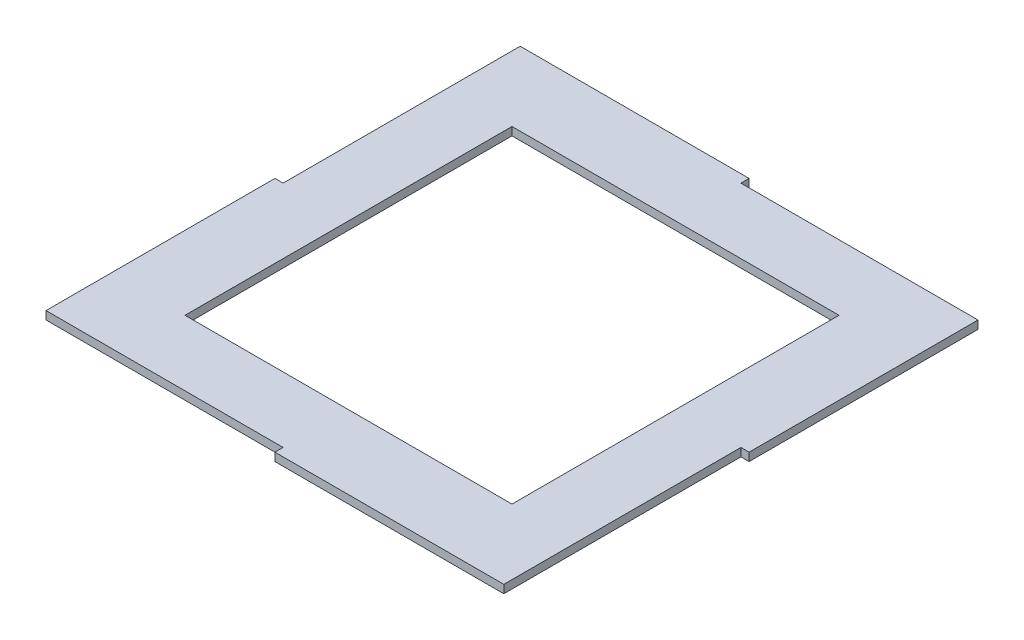
ISO-10303-21;
HEADER;
FILE_DESCRIPTION(('STEP AP214'),'2;1');
FILE_NAME('part.step','',(''),(''),'','','');
FILE_SCHEMA(('AUTOMOTIVE_DESIGN { 1 0 10303 214 1 1 1 1 }'));
ENDSEC;
DATA;
#1=APPLICATION_CONTEXT('core data for automotive mechanical design processes');
#2=APPLICATION_PROTOCOL_DEFINITION('international standard','automotive_design',2000,#1);
#3=PRODUCT_CONTEXT('',#1,'mechanical');
#4=PRODUCT('Part','Part','',(#3));
#5=PRODUCT_RELATED_PRODUCT_CATEGORY('part','',(#4));
#6=PRODUCT_DEFINITION_FORMATION('','',#4);
#7=PRODUCT_DEFINITION_CONTEXT('part definition',#1,'design');
#8=PRODUCT_DEFINITION('design','',#6,#7);
#9=PRODUCT_DEFINITION_SHAPE('','',#8);
#10=(LENGTH_UNIT() NAMED_UNIT(*) SI_UNIT(.MILLI.,.METRE.));
#11=(NAMED_UNIT(*) PLANE_ANGLE_UNIT() SI_UNIT($,.RADIAN.));
#12=(NAMED_UNIT(*) SI_UNIT($,.STERADIAN.) SOLID_ANGLE_UNIT());
#13=UNCERTAINTY_MEASURE_WITH_UNIT(LENGTH_MEASURE(1.E-05),#10,'distance_accuracy_value','');
#14=(GEOMETRIC_REPRESENTATION_CONTEXT(3) GLOBAL_UNCERTAINTY_ASSIGNED_CONTEXT((#13)) GLOBAL_UNIT_ASSIGNED_CONTEXT((#10,
#11,#12)) REPRESENTATION_CONTEXT('',''));
#15=CARTESIAN_POINT('',(0.,0.,0.));
#16=DIRECTION('',(0.,0.,1.));
#17=DIRECTION('',(1.,0.,0.));
#18=AXIS2_PLACEMENT_3D('',#15,#16,#17);
#19=CARTESIAN_POINT('',(0.,3.175,59.0872881355933));
#20=DIRECTION('',(0.,0.,1.));
#21=DIRECTION('',(1.,0.,0.));
#22=AXIS2_PLACEMENT_3D('',#19,#20,#21);
#23=PLANE('',#22);
#24=DIRECTION('',(-1.,0.,0.));
#25=VECTOR('',#24,1.);
#26=CARTESIAN_POINT('',(0.,0.,59.0872881355933));
#27=LINE('',#26,#25);
#28=CARTESIAN_POINT('',(39.8937853107345,0.,59.0872881355932));
#29=VERTEX_POINT('',#28);
#30=CARTESIAN_POINT('',(-87.1062146892655,0.,59.0872881355933));
#31=VERTEX_POINT('',#30);
#32=EDGE_CURVE('E215',#29,#31,#27,.T.);
#33=ORIENTED_EDGE('',*,*,#32,.T.);
#34=DIRECTION('',(0.,-1.,0.));
#35=VECTOR('',#34,1.);
#36=CARTESIAN_POINT('',(-87.1062146892655,3.175,59.0872881355933));
#37=LINE('',#36,#35);
#38=CARTESIAN_POINT('',(-87.1062146892655,3.175,59.0872881355933));
#39=VERTEX_POINT('',#38);
#40=EDGE_CURVE('E11',#39,#31,#37,.T.);
#41=ORIENTED_EDGE('',*,*,#40,.F.);
#42=DIRECTION('',(-1.,0.,0.));
#43=VECTOR('',#42,1.);
#44=CARTESIAN_POINT('',(0.,3.175,59.0872881355933));
#45=LINE('',#44,#43);
#46=CARTESIAN_POINT('',(39.8937853107345,3.175,59.0872881355932));
#47=VERTEX_POINT('',#46);
#48=EDGE_CURVE('E162',#47,#39,#45,.T.);
#49=ORIENTED_EDGE('',*,*,#48,.F.);
#50=DIRECTION('',(0.,-1.,0.));
#51=VECTOR('',#50,1.);
#52=CARTESIAN_POINT('',(39.8937853107345,3.175,59.0872881355932));
#53=LINE('',#52,#51);
#54=EDGE_CURVE('E54',#47,#29,#53,.T.);
#55=ORIENTED_EDGE('',*,*,#54,.T.);
#56=EDGE_LOOP('',(#33,#41,#49,#55));
#57=FACE_BOUND('',#56,.T.);
#58=ADVANCED_FACE('F35',(#57),#23,.F.);
#59=CARTESIAN_POINT('',(-87.1062146892655,3.175,0.));
#60=DIRECTION('',(-1.,0.,0.));
#61=DIRECTION('',(0.,0.,1.));
#62=AXIS2_PLACEMENT_3D('',#59,#60,#61);
#63=PLANE('',#62);
#64=DIRECTION('',(0.,0.,-1.));
#65=VECTOR('',#64,1.);
#66=CARTESIAN_POINT('',(-87.1062146892655,0.,0.));
#67=LINE('',#66,#65);
#68=CARTESIAN_POINT('',(-87.1062146892655,0.,-67.9127118644067));
#69=VERTEX_POINT('',#68);
#70=EDGE_CURVE('E168',#31,#69,#67,.T.);
#71=ORIENTED_EDGE('',*,*,#70,.T.);
#72=DIRECTION('',(0.,-1.,0.));
#73=VECTOR('',#72,1.);
#74=CARTESIAN_POINT('',(-87.1062146892655,3.175,-67.9127118644067));
#75=LINE('',#74,#73);
#76=CARTESIAN_POINT('',(-87.1062146892655,3.175,-67.9127118644067));
#77=VERTEX_POINT('',#76);
#78=EDGE_CURVE('E45',#77,#69,#75,.T.);
#79=ORIENTED_EDGE('',*,*,#78,.F.);
#80=DIRECTION('',(0.,0.,-1.));
#81=VECTOR('',#80,1.);
#82=CARTESIAN_POINT('',(-87.1062146892655,3.175,0.));
#83=LINE('',#82,#81);
#84=EDGE_CURVE('E156',#39,#77,#83,.T.);
#85=ORIENTED_EDGE('',*,*,#84,.F.);
#86=ORIENTED_EDGE('',*,*,#40,.T.);
#87=EDGE_LOOP('',(#71,#79,#85,#86));
#88=FACE_BOUND('',#87,.T.);
#89=ADVANCED_FACE('F167',(#88),#63,.F.);
#90=CARTESIAN_POINT('',(0.,3.175,-67.9127118644067));
#91=DIRECTION('',(0.,0.,1.));
#92=DIRECTION('',(1.,0.,0.));
#93=AXIS2_PLACEMENT_3D('',#90,#91,#92);
#94=PLANE('',#93);
#95=DIRECTION('',(-1.,0.,0.));
#96=VECTOR('',#95,1.);
#97=CARTESIAN_POINT('',(0.,0.,-67.9127118644067));
#98=LINE('',#97,#96);
#99=CARTESIAN_POINT('',(39.8937853107345,0.,-67.9127118644068));
#100=VERTEX_POINT('',#99);
#101=EDGE_CURVE('E218',#100,#69,#98,.T.);
#102=ORIENTED_EDGE('',*,*,#101,.F.);
#103=DIRECTION('',(0.,-1.,0.));
#104=VECTOR('',#103,1.);
#105=CARTESIAN_POINT('',(39.8937853107345,3.175,-67.9127118644068));
#106=LINE('',#105,#104);
#107=CARTESIAN_POINT('',(39.8937853107345,3.175,-67.9127118644068));
#108=VERTEX_POINT('',#107);
#109=EDGE_CURVE('E104',#108,#100,#106,.T.);
#110=ORIENTED_EDGE('',*,*,#109,.F.);
#111=DIRECTION('',(-1.,0.,0.));
#112=VECTOR('',#111,1.);
#113=CARTESIAN_POINT('',(0.,3.175,-67.9127118644067));
#114=LINE('',#113,#112);
#115=EDGE_CURVE('E161',#108,#77,#114,.T.);
#116=ORIENTED_EDGE('',*,*,#115,.T.);
#117=ORIENTED_EDGE('',*,*,#78,.T.);
#118=EDGE_LOOP('',(#102,#110,#116,#117));
#119=FACE_BOUND('',#118,.T.);
#120=ADVANCED_FACE('F172',(#119),#94,.T.);
#121=CARTESIAN_POINT('',(0.,3.175,-4.4127118644068));
#122=DIRECTION('',(0.,0.,-1.));
#123=DIRECTION('',(-1.,0.,0.));
#124=AXIS2_PLACEMENT_3D('',#121,#122,#123);
#125=PLANE('',#124);
#126=DIRECTION('',(1.,0.,0.));
#127=VECTOR('',#126,1.);
#128=CARTESIAN_POINT('',(0.,0.,-4.4127118644068));
#129=LINE('',#128,#127);
#130=CARTESIAN_POINT('',(-115.681214689266,0.,-4.41271186440677));
#131=VERTEX_POINT('',#130);
#132=CARTESIAN_POINT('',(-112.506214689266,0.,-4.41271186440677));
#133=VERTEX_POINT('',#132);
#134=EDGE_CURVE('E179',#131,#133,#129,.T.);
#135=ORIENTED_EDGE('',*,*,#134,.F.);
#136=DIRECTION('',(0.,-1.,0.));
#137=VECTOR('',#136,1.);
#138=CARTESIAN_POINT('',(-115.681214689266,3.175,-4.41271186440677));
#139=LINE('',#138,#137);
#140=CARTESIAN_POINT('',(-115.681214689266,3.175,-4.41271186440677));
#141=VERTEX_POINT('',#140);
#142=EDGE_CURVE('E39',#141,#131,#139,.T.);
#143=ORIENTED_EDGE('',*,*,#142,.F.);
#144=DIRECTION('',(1.,0.,0.));
#145=VECTOR('',#144,1.);
#146=CARTESIAN_POINT('',(0.,3.175,-4.4127118644068));
#147=LINE('',#146,#145);
#148=CARTESIAN_POINT('',(-112.506214689266,3.175,-4.41271186440677));
#149=VERTEX_POINT('',#148);
#150=EDGE_CURVE('E223',#141,#149,#147,.T.);
#151=ORIENTED_EDGE('',*,*,#150,.T.);
#152=DIRECTION('',(0.,-1.,0.));
#153=VECTOR('',#152,1.);
#154=CARTESIAN_POINT('',(-112.506214689266,3.175,-4.41271186440677));
#155=LINE('',#154,#153);
#156=EDGE_CURVE('E175',#149,#133,#155,.T.);
#157=ORIENTED_EDGE('',*,*,#156,.T.);
#158=EDGE_LOOP('',(#135,#143,#151,#157));
#159=FACE_BOUND('',#158,.T.);
#160=ADVANCED_FACE('F37',(#159),#125,.T.);
#161=CARTESIAN_POINT('',(-115.681214689266,3.175,0.));
#162=DIRECTION('',(-1.,0.,0.));
#163=DIRECTION('',(0.,0.,1.));
#164=AXIS2_PLACEMENT_3D('',#161,#162,#163);
#165=PLANE('',#164);
#166=DIRECTION('',(0.,0.,-1.));
#167=VECTOR('',#166,1.);
#168=CARTESIAN_POINT('',(-115.681214689266,0.,0.));
#169=LINE('',#168,#167);
#170=CARTESIAN_POINT('',(-115.681214689266,0.,84.4872881355932));
#171=VERTEX_POINT('',#170);
#172=EDGE_CURVE('E182',#171,#131,#169,.T.);
#173=ORIENTED_EDGE('',*,*,#172,.F.);
#174=DIRECTION('',(0.,-1.,0.));
#175=VECTOR('',#174,1.);
#176=CARTESIAN_POINT('',(-115.681214689266,3.175,84.4872881355932));
#177=LINE('',#176,#175);
#178=CARTESIAN_POINT('',(-115.681214689266,3.175,84.4872881355932));
#179=VERTEX_POINT('',#178);
#180=EDGE_CURVE('E244',#179,#171,#177,.T.);
#181=ORIENTED_EDGE('',*,*,#180,.F.);
#182=DIRECTION('',(0.,0.,-1.));
#183=VECTOR('',#182,1.);
#184=CARTESIAN_POINT('',(-115.681214689266,3.175,0.));
#185=LINE('',#184,#183);
#186=EDGE_CURVE('E253',#179,#141,#185,.T.);
#187=ORIENTED_EDGE('',*,*,#186,.T.);
#188=ORIENTED_EDGE('',*,*,#142,.T.);
#189=EDGE_LOOP('',(#173,#181,#187,#188));
#190=FACE_BOUND('',#189,.T.);
#191=ADVANCED_FACE('F251',(#190),#165,.T.);
#192=CARTESIAN_POINT('',(0.,3.175,84.4872881355932));
#193=DIRECTION('',(0.,0.,1.));
#194=DIRECTION('',(1.,0.,0.));
#195=AXIS2_PLACEMENT_3D('',#192,#193,#194);
#196=PLANE('',#195);
#197=DIRECTION('',(-1.,0.,0.));
#198=VECTOR('',#197,1.);
#199=CARTESIAN_POINT('',(0.,0.,84.4872881355932));
#200=LINE('',#199,#198);
#201=CARTESIAN_POINT('',(-23.6062146892655,0.,84.4872881355932));
#202=VERTEX_POINT('',#201);
#203=EDGE_CURVE('E185',#202,#171,#200,.T.);
#204=ORIENTED_EDGE('',*,*,#203,.F.);
#205=DIRECTION('',(0.,-1.,0.));
#206=VECTOR('',#205,1.);
#207=CARTESIAN_POINT('',(-23.6062146892655,3.175,84.4872881355932));
#208=LINE('',#207,#206);
#209=CARTESIAN_POINT('',(-23.6062146892655,3.175,84.4872881355932));
#210=VERTEX_POINT('',#209);
#211=EDGE_CURVE('E243',#210,#202,#208,.T.);
#212=ORIENTED_EDGE('',*,*,#211,.F.);
#213=DIRECTION('',(-1.,0.,0.));
#214=VECTOR('',#213,1.);
#215=CARTESIAN_POINT('',(0.,3.175,84.4872881355932));
#216=LINE('',#215,#214);
#217=EDGE_CURVE('E262',#210,#179,#216,.T.);
#218=ORIENTED_EDGE('',*,*,#217,.T.);
#219=ORIENTED_EDGE('',*,*,#180,.T.);
#220=EDGE_LOOP('',(#204,#212,#218,#219));
#221=FACE_BOUND('',#220,.T.);
#222=ADVANCED_FACE('F260',(#221),#196,.T.);
#223=CARTESIAN_POINT('',(-23.6062146892651,3.175,-1.03181744379003E-13));
#224=DIRECTION('',(-1.,0.,0.));
#225=DIRECTION('',(0.,0.,1.));
#226=AXIS2_PLACEMENT_3D('',#223,#224,#225);
#227=PLANE('',#226);
#228=DIRECTION('',(0.,0.,-1.));
#229=VECTOR('',#228,1.);
#230=CARTESIAN_POINT('',(-23.6062146892651,0.,-1.03181744379003E-13));
#231=LINE('',#230,#229);
#232=CARTESIAN_POINT('',(-23.6062146892655,0.,87.6622881355932));
#233=VERTEX_POINT('',#232);
#234=EDGE_CURVE('E188',#233,#202,#231,.T.);
#235=ORIENTED_EDGE('',*,*,#234,.F.);
#236=DIRECTION('',(0.,-1.,0.));
#237=VECTOR('',#236,1.);
#238=CARTESIAN_POINT('',(-23.6062146892655,3.175,87.6622881355932));
#239=LINE('',#238,#237);
#240=CARTESIAN_POINT('',(-23.6062146892655,3.175,87.6622881355932));
#241=VERTEX_POINT('',#240);
#242=EDGE_CURVE('E241',#241,#233,#239,.T.);
#243=ORIENTED_EDGE('',*,*,#242,.F.);
#244=DIRECTION('',(0.,0.,-1.));
#245=VECTOR('',#244,1.);
#246=CARTESIAN_POINT('',(-23.6062146892651,3.175,-1.03181744379003E-13));
#247=LINE('',#246,#245);
#248=EDGE_CURVE('E268',#241,#210,#247,.T.);
#249=ORIENTED_EDGE('',*,*,#248,.T.);
#250=ORIENTED_EDGE('',*,*,#211,.T.);
#251=EDGE_LOOP('',(#235,#243,#249,#250));
#252=FACE_BOUND('',#251,.T.);
#253=ADVANCED_FACE('F271',(#252),#227,.T.);
#254=CARTESIAN_POINT('',(0.,3.175,87.6622881355932));
#255=DIRECTION('',(0.,0.,1.));
#256=DIRECTION('',(1.,0.,0.));
#257=AXIS2_PLACEMENT_3D('',#254,#255,#256);
#258=PLANE('',#257);
#259=DIRECTION('',(-1.,0.,0.));
#260=VECTOR('',#259,1.);
#261=CARTESIAN_POINT('',(0.,0.,87.6622881355932));
#262=LINE('',#261,#260);
#263=CARTESIAN_POINT('',(65.2937853107345,0.,87.6622881355932));
#264=VERTEX_POINT('',#263);
#265=EDGE_CURVE('E191',#264,#233,#262,.T.);
#266=ORIENTED_EDGE('',*,*,#265,.F.);
#267=DIRECTION('',(0.,-1.,0.));
#268=VECTOR('',#267,1.);
#269=CARTESIAN_POINT('',(65.2937853107345,3.175,87.6622881355932));
#270=LINE('',#269,#268);
#271=CARTESIAN_POINT('',(65.2937853107345,3.175,87.6622881355932));
#272=VERTEX_POINT('',#271);
#273=EDGE_CURVE('E239',#272,#264,#270,.T.);
#274=ORIENTED_EDGE('',*,*,#273,.F.);
#275=DIRECTION('',(-1.,0.,0.));
#276=VECTOR('',#275,1.);
#277=CARTESIAN_POINT('',(0.,3.175,87.6622881355932));
#278=LINE('',#277,#276);
#279=EDGE_CURVE('E272',#272,#241,#278,.T.);
#280=ORIENTED_EDGE('',*,*,#279,.T.);
#281=ORIENTED_EDGE('',*,*,#242,.T.);
#282=EDGE_LOOP('',(#266,#274,#280,#281));
#283=FACE_BOUND('',#282,.T.);
#284=ADVANCED_FACE('F326',(#283),#258,.T.);
#285=CARTESIAN_POINT('',(65.2937853107345,3.175,0.));
#286=DIRECTION('',(1.,0.,0.));
#287=DIRECTION('',(0.,0.,-1.));
#288=AXIS2_PLACEMENT_3D('',#285,#286,#287);
#289=PLANE('',#288);
#290=DIRECTION('',(0.,0.,1.));
#291=VECTOR('',#290,1.);
#292=CARTESIAN_POINT('',(65.2937853107345,0.,0.));
#293=LINE('',#292,#291);
#294=CARTESIAN_POINT('',(65.2937853107345,0.,-4.41271186440677));
#295=VERTEX_POINT('',#294);
#296=EDGE_CURVE('E194',#295,#264,#293,.T.);
#297=ORIENTED_EDGE('',*,*,#296,.F.);
#298=DIRECTION('',(0.,-1.,0.));
#299=VECTOR('',#298,1.);
#300=CARTESIAN_POINT('',(65.2937853107345,3.175,-4.41271186440677));
#301=LINE('',#300,#299);
#302=CARTESIAN_POINT('',(65.2937853107345,3.175,-4.41271186440677));
#303=VERTEX_POINT('',#302);
#304=EDGE_CURVE('E237',#303,#295,#301,.T.);
#305=ORIENTED_EDGE('',*,*,#304,.F.);
#306=DIRECTION('',(0.,0.,1.));
#307=VECTOR('',#306,1.);
#308=CARTESIAN_POINT('',(65.2937853107345,3.175,0.));
#309=LINE('',#308,#307);
#310=EDGE_CURVE('E274',#303,#272,#309,.T.);
#311=ORIENTED_EDGE('',*,*,#310,.T.);
#312=ORIENTED_EDGE('',*,*,#273,.T.);
#313=EDGE_LOOP('',(#297,#305,#311,#312));
#314=FACE_BOUND('',#313,.T.);
#315=ADVANCED_FACE('F323',(#314),#289,.T.);
#316=CARTESIAN_POINT('',(0.,3.175,-4.41271186440675));
#317=DIRECTION('',(0.,0.,1.));
#318=DIRECTION('',(1.,0.,0.));
#319=AXIS2_PLACEMENT_3D('',#316,#317,#318);
#320=PLANE('',#319);
#321=DIRECTION('',(-1.,0.,0.));
#322=VECTOR('',#321,1.);
#323=CARTESIAN_POINT('',(0.,0.,-4.41271186440675));
#324=LINE('',#323,#322);
#325=CARTESIAN_POINT('',(68.4687853107345,0.,-4.41271186440677));
#326=VERTEX_POINT('',#325);
#327=EDGE_CURVE('E197',#326,#295,#324,.T.);
#328=ORIENTED_EDGE('',*,*,#327,.F.);
#329=DIRECTION('',(0.,-1.,0.));
#330=VECTOR('',#329,1.);
#331=CARTESIAN_POINT('',(68.4687853107345,3.175,-4.41271186440677));
#332=LINE('',#331,#330);
#333=CARTESIAN_POINT('',(68.4687853107345,3.175,-4.41271186440677));
#334=VERTEX_POINT('',#333);
#335=EDGE_CURVE('E235',#334,#326,#332,.T.);
#336=ORIENTED_EDGE('',*,*,#335,.F.);
#337=DIRECTION('',(-1.,0.,0.));
#338=VECTOR('',#337,1.);
#339=CARTESIAN_POINT('',(0.,3.175,-4.41271186440675));
#340=LINE('',#339,#338);
#341=EDGE_CURVE('E280',#334,#303,#340,.T.);
#342=ORIENTED_EDGE('',*,*,#341,.T.);
#343=ORIENTED_EDGE('',*,*,#304,.T.);
#344=EDGE_LOOP('',(#328,#336,#342,#343));
#345=FACE_BOUND('',#344,.T.);
#346=ADVANCED_FACE('F319',(#345),#320,.T.);
#347=CARTESIAN_POINT('',(68.4687853107345,3.175,0.));
#348=DIRECTION('',(1.,0.,0.));
#349=DIRECTION('',(0.,0.,-1.));
#350=AXIS2_PLACEMENT_3D('',#347,#348,#349);
#351=PLANE('',#350);
#352=DIRECTION('',(0.,0.,1.));
#353=VECTOR('',#352,1.);
#354=CARTESIAN_POINT('',(68.4687853107345,0.,0.));
#355=LINE('',#354,#353);
#356=CARTESIAN_POINT('',(68.4687853107345,0.,-93.3127118644068));
#357=VERTEX_POINT('',#356);
#358=EDGE_CURVE('E200',#357,#326,#355,.T.);
#359=ORIENTED_EDGE('',*,*,#358,.F.);
#360=DIRECTION('',(0.,-1.,0.));
#361=VECTOR('',#360,1.);
#362=CARTESIAN_POINT('',(68.4687853107345,3.175,-93.3127118644068));
#363=LINE('',#362,#361);
#364=CARTESIAN_POINT('',(68.4687853107345,3.175,-93.3127118644068));
#365=VERTEX_POINT('',#364);
#366=EDGE_CURVE('E233',#365,#357,#363,.T.);
#367=ORIENTED_EDGE('',*,*,#366,.F.);
#368=DIRECTION('',(0.,0.,1.));
#369=VECTOR('',#368,1.);
#370=CARTESIAN_POINT('',(68.4687853107345,3.175,0.));
#371=LINE('',#370,#369);
#372=EDGE_CURVE('E283',#365,#334,#371,.T.);
#373=ORIENTED_EDGE('',*,*,#372,.T.);
#374=ORIENTED_EDGE('',*,*,#335,.T.);
#375=EDGE_LOOP('',(#359,#367,#373,#374));
#376=FACE_BOUND('',#375,.T.);
#377=ADVANCED_FACE('F315',(#376),#351,.T.);
#378=CARTESIAN_POINT('',(0.,3.175,-93.3127118644068));
#379=DIRECTION('',(0.,0.,-1.));
#380=DIRECTION('',(-1.,0.,0.));
#381=AXIS2_PLACEMENT_3D('',#378,#379,#380);
#382=PLANE('',#381);
#383=DIRECTION('',(1.,0.,0.));
#384=VECTOR('',#383,1.);
#385=CARTESIAN_POINT('',(0.,0.,-93.3127118644068));
#386=LINE('',#385,#384);
#387=CARTESIAN_POINT('',(-23.6062146892655,0.,-93.3127118644068));
#388=VERTEX_POINT('',#387);
#389=EDGE_CURVE('E203',#388,#357,#386,.T.);
#390=ORIENTED_EDGE('',*,*,#389,.F.);
#391=DIRECTION('',(0.,-1.,0.));
#392=VECTOR('',#391,1.);
#393=CARTESIAN_POINT('',(-23.6062146892655,3.175,-93.3127118644068));
#394=LINE('',#393,#392);
#395=CARTESIAN_POINT('',(-23.6062146892655,3.175,-93.3127118644068));
#396=VERTEX_POINT('',#395);
#397=EDGE_CURVE('E231',#396,#388,#394,.T.);
#398=ORIENTED_EDGE('',*,*,#397,.F.);
#399=DIRECTION('',(1.,0.,0.));
#400=VECTOR('',#399,1.);
#401=CARTESIAN_POINT('',(0.,3.175,-93.3127118644068));
#402=LINE('',#401,#400);
#403=EDGE_CURVE('E286',#396,#365,#402,.T.);
#404=ORIENTED_EDGE('',*,*,#403,.T.);
#405=ORIENTED_EDGE('',*,*,#366,.T.);
#406=EDGE_LOOP('',(#390,#398,#404,#405));
#407=FACE_BOUND('',#406,.T.);
#408=ADVANCED_FACE('F311',(#407),#382,.T.);
#409=CARTESIAN_POINT('',(-23.6062146892654,3.175,0.));
#410=DIRECTION('',(1.,0.,0.));
#411=DIRECTION('',(0.,0.,-1.));
#412=AXIS2_PLACEMENT_3D('',#409,#410,#411);
#413=PLANE('',#412);
#414=DIRECTION('',(0.,0.,1.));
#415=VECTOR('',#414,1.);
#416=CARTESIAN_POINT('',(-23.6062146892654,0.,0.));
#417=LINE('',#416,#415);
#418=CARTESIAN_POINT('',(-23.6062146892655,0.,-96.4877118644068));
#419=VERTEX_POINT('',#418);
#420=EDGE_CURVE('E206',#419,#388,#417,.T.);
#421=ORIENTED_EDGE('',*,*,#420,.F.);
#422=DIRECTION('',(0.,-1.,0.));
#423=VECTOR('',#422,1.);
#424=CARTESIAN_POINT('',(-23.6062146892655,3.175,-96.4877118644068));
#425=LINE('',#424,#423);
#426=CARTESIAN_POINT('',(-23.6062146892655,3.175,-96.4877118644068));
#427=VERTEX_POINT('',#426);
#428=EDGE_CURVE('E229',#427,#419,#425,.T.);
#429=ORIENTED_EDGE('',*,*,#428,.F.);
#430=DIRECTION('',(0.,0.,1.));
#431=VECTOR('',#430,1.);
#432=CARTESIAN_POINT('',(-23.6062146892654,3.175,0.));
#433=LINE('',#432,#431);
#434=EDGE_CURVE('E289',#427,#396,#433,.T.);
#435=ORIENTED_EDGE('',*,*,#434,.T.);
#436=ORIENTED_EDGE('',*,*,#397,.T.);
#437=EDGE_LOOP('',(#421,#429,#435,#436));
#438=FACE_BOUND('',#437,.T.);
#439=ADVANCED_FACE('F307',(#438),#413,.T.);
#440=CARTESIAN_POINT('',(0.,3.175,-96.4877118644068));
#441=DIRECTION('',(0.,0.,-1.));
#442=DIRECTION('',(-1.,0.,0.));
#443=AXIS2_PLACEMENT_3D('',#440,#441,#442);
#444=PLANE('',#443);
#445=DIRECTION('',(1.,0.,0.));
#446=VECTOR('',#445,1.);
#447=CARTESIAN_POINT('',(0.,0.,-96.4877118644068));
#448=LINE('',#447,#446);
#449=CARTESIAN_POINT('',(-112.506214689266,0.,-96.4877118644068));
#450=VERTEX_POINT('',#449);
#451=EDGE_CURVE('E209',#450,#419,#448,.T.);
#452=ORIENTED_EDGE('',*,*,#451,.F.);
#453=DIRECTION('',(0.,-1.,0.));
#454=VECTOR('',#453,1.);
#455=CARTESIAN_POINT('',(-112.506214689266,3.175,-96.4877118644068));
#456=LINE('',#455,#454);
#457=CARTESIAN_POINT('',(-112.506214689266,3.175,-96.4877118644068));
#458=VERTEX_POINT('',#457);
#459=EDGE_CURVE('E227',#458,#450,#456,.T.);
#460=ORIENTED_EDGE('',*,*,#459,.F.);
#461=DIRECTION('',(1.,0.,0.));
#462=VECTOR('',#461,1.);
#463=CARTESIAN_POINT('',(0.,3.175,-96.4877118644068));
#464=LINE('',#463,#462);
#465=EDGE_CURVE('E292',#458,#427,#464,.T.);
#466=ORIENTED_EDGE('',*,*,#465,.T.);
#467=ORIENTED_EDGE('',*,*,#428,.T.);
#468=EDGE_LOOP('',(#452,#460,#466,#467));
#469=FACE_BOUND('',#468,.T.);
#470=ADVANCED_FACE('F304',(#469),#444,.T.);
#471=CARTESIAN_POINT('',(-112.506214689266,3.175,0.));
#472=DIRECTION('',(1.,0.,0.));
#473=DIRECTION('',(0.,0.,-1.));
#474=AXIS2_PLACEMENT_3D('',#471,#472,#473);
#475=PLANE('',#474);
#476=DIRECTION('',(0.,0.,1.));
#477=VECTOR('',#476,1.);
#478=CARTESIAN_POINT('',(-112.506214689266,0.,0.));
#479=LINE('',#478,#477);
#480=EDGE_CURVE('E212',#450,#133,#479,.T.);
#481=ORIENTED_EDGE('',*,*,#480,.T.);
#482=ORIENTED_EDGE('',*,*,#156,.F.);
#483=DIRECTION('',(0.,0.,1.));
#484=VECTOR('',#483,1.);
#485=CARTESIAN_POINT('',(-112.506214689266,3.175,0.));
#486=LINE('',#485,#484);
#487=EDGE_CURVE('E295',#458,#149,#486,.T.);
#488=ORIENTED_EDGE('',*,*,#487,.F.);
#489=ORIENTED_EDGE('',*,*,#459,.T.);
#490=EDGE_LOOP('',(#481,#482,#488,#489));
#491=FACE_BOUND('',#490,.T.);
#492=ADVANCED_FACE('F300',(#491),#475,.F.);
#493=CARTESIAN_POINT('',(39.8937853107345,3.175,0.));
#494=DIRECTION('',(-1.,0.,0.));
#495=DIRECTION('',(0.,0.,1.));
#496=AXIS2_PLACEMENT_3D('',#493,#494,#495);
#497=PLANE('',#496);
#498=DIRECTION('',(0.,0.,-1.));
#499=VECTOR('',#498,1.);
#500=CARTESIAN_POINT('',(39.8937853107345,0.,0.));
#501=LINE('',#500,#499);
#502=EDGE_CURVE('E220',#29,#100,#501,.T.);
#503=ORIENTED_EDGE('',*,*,#502,.F.);
#504=ORIENTED_EDGE('',*,*,#54,.F.);
#505=DIRECTION('',(0.,0.,-1.));
#506=VECTOR('',#505,1.);
#507=CARTESIAN_POINT('',(39.8937853107345,3.175,0.));
#508=LINE('',#507,#506);
#509=EDGE_CURVE('E173',#47,#108,#508,.T.);
#510=ORIENTED_EDGE('',*,*,#509,.T.);
#511=ORIENTED_EDGE('',*,*,#109,.T.);
#512=EDGE_LOOP('',(#503,#504,#510,#511));
#513=FACE_BOUND('',#512,.T.);
#514=ADVANCED_FACE('F345',(#513),#497,.T.);
#515=CARTESIAN_POINT('',(0.,3.175,0.));
#516=DIRECTION('',(0.,1.,0.));
#517=DIRECTION('',(0.,0.,1.));
#518=AXIS2_PLACEMENT_3D('',#515,#516,#517);
#519=PLANE('',#518);
#520=ORIENTED_EDGE('',*,*,#150,.F.);
#521=ORIENTED_EDGE('',*,*,#186,.F.);
#522=ORIENTED_EDGE('',*,*,#217,.F.);
#523=ORIENTED_EDGE('',*,*,#248,.F.);
#524=ORIENTED_EDGE('',*,*,#279,.F.);
#525=ORIENTED_EDGE('',*,*,#310,.F.);
#526=ORIENTED_EDGE('',*,*,#341,.F.);
#527=ORIENTED_EDGE('',*,*,#372,.F.);
#528=ORIENTED_EDGE('',*,*,#403,.F.);
#529=ORIENTED_EDGE('',*,*,#434,.F.);
#530=ORIENTED_EDGE('',*,*,#465,.F.);
#531=ORIENTED_EDGE('',*,*,#487,.T.);
#532=EDGE_LOOP('',(#520,#521,#522,#523,#524,#525,#526,#527,#528,#529,#530,#531));
#533=FACE_BOUND('',#532,.T.);
#534=ORIENTED_EDGE('',*,*,#48,.T.);
#535=ORIENTED_EDGE('',*,*,#84,.T.);
#536=ORIENTED_EDGE('',*,*,#115,.F.);
#537=ORIENTED_EDGE('',*,*,#509,.F.);
#538=EDGE_LOOP('',(#534,#535,#536,#537));
#539=FACE_BOUND('',#538,.T.);
#540=ADVANCED_FACE('F158',(#533,#539),#519,.T.);
#541=CARTESIAN_POINT('',(0.,0.,0.));
#542=DIRECTION('',(0.,1.,0.));
#543=DIRECTION('',(0.,0.,1.));
#544=AXIS2_PLACEMENT_3D('',#541,#542,#543);
#545=PLANE('',#544);
#546=ORIENTED_EDGE('',*,*,#134,.T.);
#547=ORIENTED_EDGE('',*,*,#480,.F.);
#548=ORIENTED_EDGE('',*,*,#451,.T.);
#549=ORIENTED_EDGE('',*,*,#420,.T.);
#550=ORIENTED_EDGE('',*,*,#389,.T.);
#551=ORIENTED_EDGE('',*,*,#358,.T.);
#552=ORIENTED_EDGE('',*,*,#327,.T.);
#553=ORIENTED_EDGE('',*,*,#296,.T.);
#554=ORIENTED_EDGE('',*,*,#265,.T.);
#555=ORIENTED_EDGE('',*,*,#234,.T.);
#556=ORIENTED_EDGE('',*,*,#203,.T.);
#557=ORIENTED_EDGE('',*,*,#172,.T.);
#558=EDGE_LOOP('',(#546,#547,#548,#549,#550,#551,#552,#553,#554,#555,#556,#557));
#559=FACE_BOUND('',#558,.T.);
#560=ORIENTED_EDGE('',*,*,#32,.F.);
#561=ORIENTED_EDGE('',*,*,#502,.T.);
#562=ORIENTED_EDGE('',*,*,#101,.T.);
#563=ORIENTED_EDGE('',*,*,#70,.F.);
#564=EDGE_LOOP('',(#560,#561,#562,#563));
#565=FACE_BOUND('',#564,.T.);
#566=ADVANCED_FACE('F257',(#559,#565),#545,.F.);
#567=CLOSED_SHELL('',(#58,#89,#120,#160,#191,#222,#253,#284,#315,#346,#377,#408,#439,#470,#492,
#514,#540,#566));
#568=MANIFOLD_SOLID_BREP('B2',#567);
#569=ADVANCED_BREP_SHAPE_REPRESENTATION('',(#18,#568),#14);
#570=SHAPE_DEFINITION_REPRESENTATION(#9,#569);
ENDSEC;
END-ISO-10303-21;
